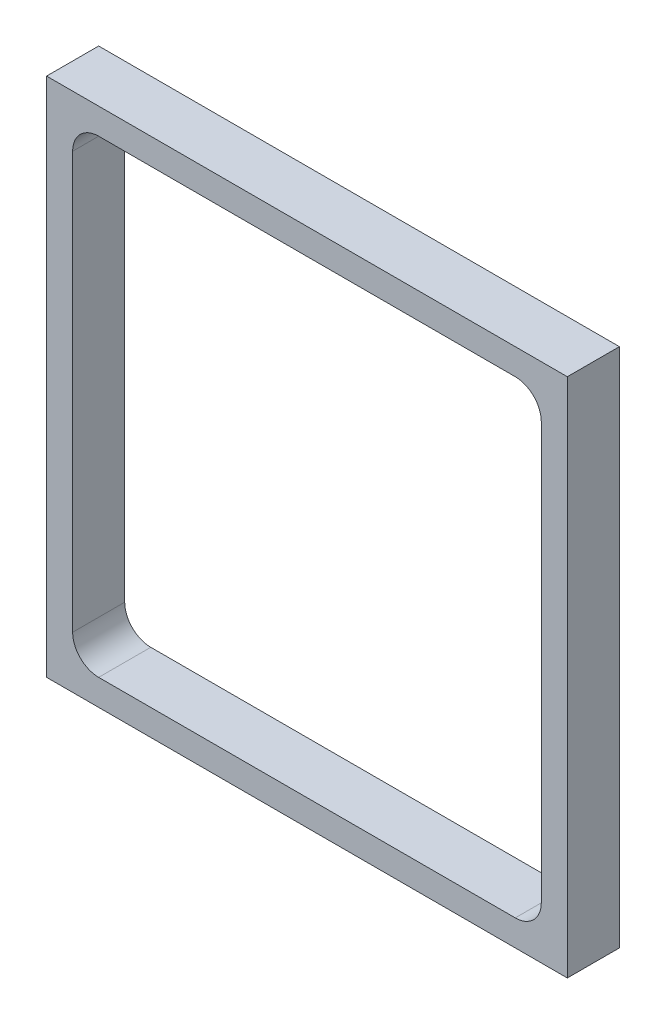
ISO-10303-21;
HEADER;
FILE_DESCRIPTION(('STEP AP214'),'2;1');
FILE_NAME('part.step','',(''),(''),'','','');
FILE_SCHEMA(('AUTOMOTIVE_DESIGN { 1 0 10303 214 1 1 1 1 }'));
ENDSEC;
DATA;
#1=APPLICATION_CONTEXT('core data for automotive mechanical design processes');
#2=APPLICATION_PROTOCOL_DEFINITION('international standard','automotive_design',2000,#1);
#3=PRODUCT_CONTEXT('',#1,'mechanical');
#4=PRODUCT('Part','Part','',(#3));
#5=PRODUCT_RELATED_PRODUCT_CATEGORY('part','',(#4));
#6=PRODUCT_DEFINITION_FORMATION('','',#4);
#7=PRODUCT_DEFINITION_CONTEXT('part definition',#1,'design');
#8=PRODUCT_DEFINITION('design','',#6,#7);
#9=PRODUCT_DEFINITION_SHAPE('','',#8);
#10=(LENGTH_UNIT() NAMED_UNIT(*) SI_UNIT(.MILLI.,.METRE.));
#11=(NAMED_UNIT(*) PLANE_ANGLE_UNIT() SI_UNIT($,.RADIAN.));
#12=(NAMED_UNIT(*) SI_UNIT($,.STERADIAN.) SOLID_ANGLE_UNIT());
#13=UNCERTAINTY_MEASURE_WITH_UNIT(LENGTH_MEASURE(1.E-05),#10,'distance_accuracy_value','');
#14=(GEOMETRIC_REPRESENTATION_CONTEXT(3) GLOBAL_UNCERTAINTY_ASSIGNED_CONTEXT((#13)) GLOBAL_UNIT_ASSIGNED_CONTEXT((#10,
#11,#12)) REPRESENTATION_CONTEXT('',''));
#15=CARTESIAN_POINT('',(0.,0.,0.));
#16=DIRECTION('',(0.,0.,1.));
#17=DIRECTION('',(1.,0.,0.));
#18=AXIS2_PLACEMENT_3D('',#15,#16,#17);
#19=CARTESIAN_POINT('',(63.5,-63.5,-12.7));
#20=DIRECTION('',(1.,0.,0.));
#21=DIRECTION('',(0.,0.,-1.));
#22=AXIS2_PLACEMENT_3D('',#19,#20,#21);
#23=PLANE('',#22);
#24=DIRECTION('',(0.,1.,0.));
#25=VECTOR('',#24,1.);
#26=CARTESIAN_POINT('',(63.5,-63.5,0.));
#27=LINE('',#26,#25);
#28=CARTESIAN_POINT('',(63.5,-63.5,0.));
#29=VERTEX_POINT('',#28);
#30=CARTESIAN_POINT('',(63.5,63.5,0.));
#31=VERTEX_POINT('',#30);
#32=EDGE_CURVE('E170',#29,#31,#27,.T.);
#33=ORIENTED_EDGE('',*,*,#32,.F.);
#34=DIRECTION('',(0.,0.,1.));
#35=VECTOR('',#34,1.);
#36=CARTESIAN_POINT('',(63.5,-63.5,-12.7));
#37=LINE('',#36,#35);
#38=CARTESIAN_POINT('',(63.5,-63.5,-12.7));
#39=VERTEX_POINT('',#38);
#40=EDGE_CURVE('E154',#39,#29,#37,.T.);
#41=ORIENTED_EDGE('',*,*,#40,.F.);
#42=DIRECTION('',(0.,1.,0.));
#43=VECTOR('',#42,1.);
#44=CARTESIAN_POINT('',(63.5,-63.5,-12.7));
#45=LINE('',#44,#43);
#46=CARTESIAN_POINT('',(63.5,63.5,-12.7));
#47=VERTEX_POINT('',#46);
#48=EDGE_CURVE('E148',#39,#47,#45,.T.);
#49=ORIENTED_EDGE('',*,*,#48,.T.);
#50=DIRECTION('',(0.,0.,1.));
#51=VECTOR('',#50,1.);
#52=CARTESIAN_POINT('',(63.5,63.5,-12.7));
#53=LINE('',#52,#51);
#54=EDGE_CURVE('E129',#47,#31,#53,.T.);
#55=ORIENTED_EDGE('',*,*,#54,.T.);
#56=EDGE_LOOP('',(#33,#41,#49,#55));
#57=FACE_BOUND('',#56,.T.);
#58=ADVANCED_FACE('F39',(#57),#23,.T.);
#59=CARTESIAN_POINT('',(-63.5,-63.5,-12.7));
#60=DIRECTION('',(0.,-1.,0.));
#61=DIRECTION('',(0.,0.,-1.));
#62=AXIS2_PLACEMENT_3D('',#59,#60,#61);
#63=PLANE('',#62);
#64=DIRECTION('',(1.,0.,0.));
#65=VECTOR('',#64,1.);
#66=CARTESIAN_POINT('',(-63.5,-63.5,0.));
#67=LINE('',#66,#65);
#68=CARTESIAN_POINT('',(-63.5,-63.5,0.));
#69=VERTEX_POINT('',#68);
#70=EDGE_CURVE('E156',#69,#29,#67,.T.);
#71=ORIENTED_EDGE('',*,*,#70,.F.);
#72=DIRECTION('',(0.,0.,1.));
#73=VECTOR('',#72,1.);
#74=CARTESIAN_POINT('',(-63.5,-63.5,-12.7));
#75=LINE('',#74,#73);
#76=CARTESIAN_POINT('',(-63.5,-63.5,-12.7));
#77=VERTEX_POINT('',#76);
#78=EDGE_CURVE('E182',#77,#69,#75,.T.);
#79=ORIENTED_EDGE('',*,*,#78,.F.);
#80=DIRECTION('',(1.,0.,0.));
#81=VECTOR('',#80,1.);
#82=CARTESIAN_POINT('',(-63.5,-63.5,-12.7));
#83=LINE('',#82,#81);
#84=EDGE_CURVE('E141',#77,#39,#83,.T.);
#85=ORIENTED_EDGE('',*,*,#84,.T.);
#86=ORIENTED_EDGE('',*,*,#40,.T.);
#87=EDGE_LOOP('',(#71,#79,#85,#86));
#88=FACE_BOUND('',#87,.T.);
#89=ADVANCED_FACE('F299',(#88),#63,.T.);
#90=CARTESIAN_POINT('',(-63.5,-63.5,-12.7));
#91=DIRECTION('',(-1.,0.,0.));
#92=DIRECTION('',(0.,0.,1.));
#93=AXIS2_PLACEMENT_3D('',#90,#91,#92);
#94=PLANE('',#93);
#95=DIRECTION('',(0.,-1.,0.));
#96=VECTOR('',#95,1.);
#97=CARTESIAN_POINT('',(-63.5,-63.5,0.));
#98=LINE('',#97,#96);
#99=CARTESIAN_POINT('',(-63.5,63.5,0.));
#100=VERTEX_POINT('',#99);
#101=EDGE_CURVE('E160',#100,#69,#98,.T.);
#102=ORIENTED_EDGE('',*,*,#101,.F.);
#103=DIRECTION('',(0.,0.,1.));
#104=VECTOR('',#103,1.);
#105=CARTESIAN_POINT('',(-63.5,63.5,-12.7));
#106=LINE('',#105,#104);
#107=CARTESIAN_POINT('',(-63.5,63.5,-12.7));
#108=VERTEX_POINT('',#107);
#109=EDGE_CURVE('E140',#108,#100,#106,.T.);
#110=ORIENTED_EDGE('',*,*,#109,.F.);
#111=DIRECTION('',(0.,-1.,0.));
#112=VECTOR('',#111,1.);
#113=CARTESIAN_POINT('',(-63.5,-63.5,-12.7));
#114=LINE('',#113,#112);
#115=EDGE_CURVE('E151',#108,#77,#114,.T.);
#116=ORIENTED_EDGE('',*,*,#115,.T.);
#117=ORIENTED_EDGE('',*,*,#78,.T.);
#118=EDGE_LOOP('',(#102,#110,#116,#117));
#119=FACE_BOUND('',#118,.T.);
#120=ADVANCED_FACE('F304',(#119),#94,.T.);
#121=CARTESIAN_POINT('',(-63.5,63.5,-12.7));
#122=DIRECTION('',(0.,1.,0.));
#123=DIRECTION('',(0.,0.,1.));
#124=AXIS2_PLACEMENT_3D('',#121,#122,#123);
#125=PLANE('',#124);
#126=DIRECTION('',(-1.,0.,0.));
#127=VECTOR('',#126,1.);
#128=CARTESIAN_POINT('',(-63.5,63.5,0.));
#129=LINE('',#128,#127);
#130=EDGE_CURVE('E134',#31,#100,#129,.T.);
#131=ORIENTED_EDGE('',*,*,#130,.F.);
#132=ORIENTED_EDGE('',*,*,#54,.F.);
#133=DIRECTION('',(-1.,0.,0.));
#134=VECTOR('',#133,1.);
#135=CARTESIAN_POINT('',(-63.5,63.5,-12.7));
#136=LINE('',#135,#134);
#137=EDGE_CURVE('E132',#47,#108,#136,.T.);
#138=ORIENTED_EDGE('',*,*,#137,.T.);
#139=ORIENTED_EDGE('',*,*,#109,.T.);
#140=EDGE_LOOP('',(#131,#132,#138,#139));
#141=FACE_BOUND('',#140,.T.);
#142=ADVANCED_FACE('F131',(#141),#125,.T.);
#143=CARTESIAN_POINT('',(0.,0.,-12.7));
#144=DIRECTION('',(0.,0.,-1.));
#145=DIRECTION('',(-1.,0.,0.));
#146=AXIS2_PLACEMENT_3D('',#143,#144,#145);
#147=PLANE('',#146);
#148=DIRECTION('',(1.,0.,0.));
#149=VECTOR('',#148,1.);
#150=CARTESIAN_POINT('',(-57.15,-57.15,-12.7));
#151=LINE('',#150,#149);
#152=CARTESIAN_POINT('',(-50.8,-57.15,-12.7));
#153=VERTEX_POINT('',#152);
#154=CARTESIAN_POINT('',(50.8,-57.15,-12.7));
#155=VERTEX_POINT('',#154);
#156=EDGE_CURVE('E173',#153,#155,#151,.T.);
#157=ORIENTED_EDGE('',*,*,#156,.T.);
#158=CARTESIAN_POINT('',(50.8,-50.8,-12.7));
#159=DIRECTION('',(0.,0.,-1.));
#160=DIRECTION('',(-1.,0.,0.));
#161=AXIS2_PLACEMENT_3D('',#158,#159,#160);
#162=CIRCLE('',#161,6.35);
#163=CARTESIAN_POINT('',(57.15,-50.8,-12.7));
#164=VERTEX_POINT('',#163);
#165=EDGE_CURVE('E216',#155,#164,#162,.F.);
#166=ORIENTED_EDGE('',*,*,#165,.T.);
#167=DIRECTION('',(0.,1.,0.));
#168=VECTOR('',#167,1.);
#169=CARTESIAN_POINT('',(57.15,-57.15,-12.7));
#170=LINE('',#169,#168);
#171=CARTESIAN_POINT('',(57.15,50.8,-12.7));
#172=VERTEX_POINT('',#171);
#173=EDGE_CURVE('E253',#164,#172,#170,.T.);
#174=ORIENTED_EDGE('',*,*,#173,.T.);
#175=CARTESIAN_POINT('',(50.8,50.8,-12.7));
#176=DIRECTION('',(0.,0.,-1.));
#177=DIRECTION('',(-1.,0.,0.));
#178=AXIS2_PLACEMENT_3D('',#175,#176,#177);
#179=CIRCLE('',#178,6.35);
#180=CARTESIAN_POINT('',(50.8,57.15,-12.7));
#181=VERTEX_POINT('',#180);
#182=EDGE_CURVE('E11',#172,#181,#179,.F.);
#183=ORIENTED_EDGE('',*,*,#182,.T.);
#184=DIRECTION('',(-1.,0.,0.));
#185=VECTOR('',#184,1.);
#186=CARTESIAN_POINT('',(-57.15,57.15,-12.7));
#187=LINE('',#186,#185);
#188=CARTESIAN_POINT('',(-50.8,57.15,-12.7));
#189=VERTEX_POINT('',#188);
#190=EDGE_CURVE('E249',#181,#189,#187,.T.);
#191=ORIENTED_EDGE('',*,*,#190,.T.);
#192=CARTESIAN_POINT('',(-50.8,50.8,-12.7));
#193=DIRECTION('',(0.,0.,-1.));
#194=DIRECTION('',(-1.,0.,0.));
#195=AXIS2_PLACEMENT_3D('',#192,#193,#194);
#196=CIRCLE('',#195,6.35);
#197=CARTESIAN_POINT('',(-57.15,50.8,-12.7));
#198=VERTEX_POINT('',#197);
#199=EDGE_CURVE('E228',#189,#198,#196,.F.);
#200=ORIENTED_EDGE('',*,*,#199,.T.);
#201=DIRECTION('',(0.,-1.,0.));
#202=VECTOR('',#201,1.);
#203=CARTESIAN_POINT('',(-57.15,-57.15,-12.7));
#204=LINE('',#203,#202);
#205=CARTESIAN_POINT('',(-57.15,-50.8,-12.7));
#206=VERTEX_POINT('',#205);
#207=EDGE_CURVE('E252',#198,#206,#204,.T.);
#208=ORIENTED_EDGE('',*,*,#207,.T.);
#209=CARTESIAN_POINT('',(-50.8,-50.8,-12.7));
#210=DIRECTION('',(0.,0.,-1.));
#211=DIRECTION('',(-1.,0.,0.));
#212=AXIS2_PLACEMENT_3D('',#209,#210,#211);
#213=CIRCLE('',#212,6.35);
#214=EDGE_CURVE('E222',#206,#153,#213,.F.);
#215=ORIENTED_EDGE('',*,*,#214,.T.);
#216=EDGE_LOOP('',(#157,#166,#174,#183,#191,#200,#208,#215));
#217=FACE_BOUND('',#216,.T.);
#218=ORIENTED_EDGE('',*,*,#48,.F.);
#219=ORIENTED_EDGE('',*,*,#84,.F.);
#220=ORIENTED_EDGE('',*,*,#115,.F.);
#221=ORIENTED_EDGE('',*,*,#137,.F.);
#222=EDGE_LOOP('',(#218,#219,#220,#221));
#223=FACE_BOUND('',#222,.T.);
#224=ADVANCED_FACE('F146',(#217,#223),#147,.T.);
#225=CARTESIAN_POINT('',(0.,0.,0.));
#226=DIRECTION('',(0.,0.,-1.));
#227=DIRECTION('',(-1.,0.,0.));
#228=AXIS2_PLACEMENT_3D('',#225,#226,#227);
#229=PLANE('',#228);
#230=DIRECTION('',(-1.,0.,0.));
#231=VECTOR('',#230,1.);
#232=CARTESIAN_POINT('',(-57.15,57.15,0.));
#233=LINE('',#232,#231);
#234=CARTESIAN_POINT('',(50.8,57.15,0.));
#235=VERTEX_POINT('',#234);
#236=CARTESIAN_POINT('',(-50.8,57.15,0.));
#237=VERTEX_POINT('',#236);
#238=EDGE_CURVE('E238',#235,#237,#233,.T.);
#239=ORIENTED_EDGE('',*,*,#238,.F.);
#240=CARTESIAN_POINT('',(50.8,50.8,0.));
#241=DIRECTION('',(0.,0.,-1.));
#242=DIRECTION('',(-1.,0.,0.));
#243=AXIS2_PLACEMENT_3D('',#240,#241,#242);
#244=CIRCLE('',#243,6.35);
#245=CARTESIAN_POINT('',(57.15,50.8,0.));
#246=VERTEX_POINT('',#245);
#247=EDGE_CURVE('E48',#235,#246,#244,.T.);
#248=ORIENTED_EDGE('',*,*,#247,.T.);
#249=DIRECTION('',(0.,1.,0.));
#250=VECTOR('',#249,1.);
#251=CARTESIAN_POINT('',(57.15,-57.15,0.));
#252=LINE('',#251,#250);
#253=CARTESIAN_POINT('',(57.15,-50.8,0.));
#254=VERTEX_POINT('',#253);
#255=EDGE_CURVE('E237',#254,#246,#252,.T.);
#256=ORIENTED_EDGE('',*,*,#255,.F.);
#257=CARTESIAN_POINT('',(50.8,-50.8,0.));
#258=DIRECTION('',(0.,0.,-1.));
#259=DIRECTION('',(-1.,0.,0.));
#260=AXIS2_PLACEMENT_3D('',#257,#258,#259);
#261=CIRCLE('',#260,6.35);
#262=CARTESIAN_POINT('',(50.8,-57.15,0.));
#263=VERTEX_POINT('',#262);
#264=EDGE_CURVE('E213',#254,#263,#261,.T.);
#265=ORIENTED_EDGE('',*,*,#264,.T.);
#266=DIRECTION('',(1.,0.,0.));
#267=VECTOR('',#266,1.);
#268=CARTESIAN_POINT('',(-57.15,-57.15,0.));
#269=LINE('',#268,#267);
#270=CARTESIAN_POINT('',(-50.8,-57.15,0.));
#271=VERTEX_POINT('',#270);
#272=EDGE_CURVE('E163',#271,#263,#269,.T.);
#273=ORIENTED_EDGE('',*,*,#272,.F.);
#274=CARTESIAN_POINT('',(-50.8,-50.8,0.));
#275=DIRECTION('',(0.,0.,-1.));
#276=DIRECTION('',(-1.,0.,0.));
#277=AXIS2_PLACEMENT_3D('',#274,#275,#276);
#278=CIRCLE('',#277,6.35);
#279=CARTESIAN_POINT('',(-57.15,-50.8,0.));
#280=VERTEX_POINT('',#279);
#281=EDGE_CURVE('E219',#271,#280,#278,.T.);
#282=ORIENTED_EDGE('',*,*,#281,.T.);
#283=DIRECTION('',(0.,-1.,0.));
#284=VECTOR('',#283,1.);
#285=CARTESIAN_POINT('',(-57.15,-57.15,0.));
#286=LINE('',#285,#284);
#287=CARTESIAN_POINT('',(-57.15,50.8,0.));
#288=VERTEX_POINT('',#287);
#289=EDGE_CURVE('E265',#288,#280,#286,.T.);
#290=ORIENTED_EDGE('',*,*,#289,.F.);
#291=CARTESIAN_POINT('',(-50.8,50.8,0.));
#292=DIRECTION('',(0.,0.,-1.));
#293=DIRECTION('',(-1.,0.,0.));
#294=AXIS2_PLACEMENT_3D('',#291,#292,#293);
#295=CIRCLE('',#294,6.35);
#296=EDGE_CURVE('E225',#288,#237,#295,.T.);
#297=ORIENTED_EDGE('',*,*,#296,.T.);
#298=EDGE_LOOP('',(#239,#248,#256,#265,#273,#282,#290,#297));
#299=FACE_BOUND('',#298,.T.);
#300=ORIENTED_EDGE('',*,*,#32,.T.);
#301=ORIENTED_EDGE('',*,*,#130,.T.);
#302=ORIENTED_EDGE('',*,*,#101,.T.);
#303=ORIENTED_EDGE('',*,*,#70,.T.);
#304=EDGE_LOOP('',(#300,#301,#302,#303));
#305=FACE_BOUND('',#304,.T.);
#306=ADVANCED_FACE('F235',(#299,#305),#229,.F.);
#307=CARTESIAN_POINT('',(57.15,-57.15,-12.7));
#308=DIRECTION('',(1.,0.,0.));
#309=DIRECTION('',(0.,0.,-1.));
#310=AXIS2_PLACEMENT_3D('',#307,#308,#309);
#311=PLANE('',#310);
#312=ORIENTED_EDGE('',*,*,#173,.F.);
#313=DIRECTION('',(0.,0.,1.));
#314=VECTOR('',#313,1.);
#315=CARTESIAN_POINT('',(57.15,-50.8,0.));
#316=LINE('',#315,#314);
#317=EDGE_CURVE('E189',#164,#254,#316,.T.);
#318=ORIENTED_EDGE('',*,*,#317,.T.);
#319=ORIENTED_EDGE('',*,*,#255,.T.);
#320=DIRECTION('',(0.,0.,1.));
#321=VECTOR('',#320,1.);
#322=CARTESIAN_POINT('',(57.15,50.8,-12.7));
#323=LINE('',#322,#321);
#324=EDGE_CURVE('E181',#246,#172,#323,.F.);
#325=ORIENTED_EDGE('',*,*,#324,.T.);
#326=EDGE_LOOP('',(#312,#318,#319,#325));
#327=FACE_BOUND('',#326,.T.);
#328=ADVANCED_FACE('F244',(#327),#311,.F.);
#329=CARTESIAN_POINT('',(-57.15,-57.15,-12.7));
#330=DIRECTION('',(0.,-1.,0.));
#331=DIRECTION('',(0.,0.,-1.));
#332=AXIS2_PLACEMENT_3D('',#329,#330,#331);
#333=PLANE('',#332);
#334=ORIENTED_EDGE('',*,*,#272,.T.);
#335=DIRECTION('',(0.,0.,1.));
#336=VECTOR('',#335,1.);
#337=CARTESIAN_POINT('',(50.8,-57.15,-12.7));
#338=LINE('',#337,#336);
#339=EDGE_CURVE('E197',#263,#155,#338,.F.);
#340=ORIENTED_EDGE('',*,*,#339,.T.);
#341=ORIENTED_EDGE('',*,*,#156,.F.);
#342=DIRECTION('',(0.,0.,1.));
#343=VECTOR('',#342,1.);
#344=CARTESIAN_POINT('',(-50.8,-57.15,0.));
#345=LINE('',#344,#343);
#346=EDGE_CURVE('E193',#153,#271,#345,.T.);
#347=ORIENTED_EDGE('',*,*,#346,.T.);
#348=EDGE_LOOP('',(#334,#340,#341,#347));
#349=FACE_BOUND('',#348,.T.);
#350=ADVANCED_FACE('F276',(#349),#333,.F.);
#351=CARTESIAN_POINT('',(-57.15,-57.15,-12.7));
#352=DIRECTION('',(-1.,0.,0.));
#353=DIRECTION('',(0.,0.,1.));
#354=AXIS2_PLACEMENT_3D('',#351,#352,#353);
#355=PLANE('',#354);
#356=ORIENTED_EDGE('',*,*,#289,.T.);
#357=DIRECTION('',(0.,0.,1.));
#358=VECTOR('',#357,1.);
#359=CARTESIAN_POINT('',(-57.15,-50.8,-12.7));
#360=LINE('',#359,#358);
#361=EDGE_CURVE('E204',#280,#206,#360,.F.);
#362=ORIENTED_EDGE('',*,*,#361,.T.);
#363=ORIENTED_EDGE('',*,*,#207,.F.);
#364=DIRECTION('',(0.,0.,1.));
#365=VECTOR('',#364,1.);
#366=CARTESIAN_POINT('',(-57.15,50.8,0.));
#367=LINE('',#366,#365);
#368=EDGE_CURVE('E200',#198,#288,#367,.T.);
#369=ORIENTED_EDGE('',*,*,#368,.T.);
#370=EDGE_LOOP('',(#356,#362,#363,#369));
#371=FACE_BOUND('',#370,.T.);
#372=ADVANCED_FACE('F289',(#371),#355,.F.);
#373=CARTESIAN_POINT('',(-57.15,57.15,-12.7));
#374=DIRECTION('',(0.,1.,0.));
#375=DIRECTION('',(0.,0.,1.));
#376=AXIS2_PLACEMENT_3D('',#373,#374,#375);
#377=PLANE('',#376);
#378=ORIENTED_EDGE('',*,*,#238,.T.);
#379=DIRECTION('',(0.,0.,1.));
#380=VECTOR('',#379,1.);
#381=CARTESIAN_POINT('',(-50.8,57.15,-12.7));
#382=LINE('',#381,#380);
#383=EDGE_CURVE('E55',#237,#189,#382,.F.);
#384=ORIENTED_EDGE('',*,*,#383,.T.);
#385=ORIENTED_EDGE('',*,*,#190,.F.);
#386=DIRECTION('',(0.,0.,1.));
#387=VECTOR('',#386,1.);
#388=CARTESIAN_POINT('',(50.8,57.15,0.));
#389=LINE('',#388,#387);
#390=EDGE_CURVE('E207',#181,#235,#389,.T.);
#391=ORIENTED_EDGE('',*,*,#390,.T.);
#392=EDGE_LOOP('',(#378,#384,#385,#391));
#393=FACE_BOUND('',#392,.T.);
#394=ADVANCED_FACE('F248',(#393),#377,.F.);
#395=CARTESIAN_POINT('',(50.8,-50.8,-12.7));
#396=DIRECTION('',(0.,0.,-1.));
#397=DIRECTION('',(-1.,0.,0.));
#398=AXIS2_PLACEMENT_3D('',#395,#396,#397);
#399=CYLINDRICAL_SURFACE('',#398,6.35);
#400=ORIENTED_EDGE('',*,*,#165,.F.);
#401=ORIENTED_EDGE('',*,*,#339,.F.);
#402=ORIENTED_EDGE('',*,*,#264,.F.);
#403=ORIENTED_EDGE('',*,*,#317,.F.);
#404=EDGE_LOOP('',(#400,#401,#402,#403));
#405=FACE_BOUND('',#404,.T.);
#406=ADVANCED_FACE('F281',(#405),#399,.F.);
#407=CARTESIAN_POINT('',(-50.8,-50.8,-12.7));
#408=DIRECTION('',(0.,0.,-1.));
#409=DIRECTION('',(-1.,0.,0.));
#410=AXIS2_PLACEMENT_3D('',#407,#408,#409);
#411=CYLINDRICAL_SURFACE('',#410,6.35);
#412=ORIENTED_EDGE('',*,*,#214,.F.);
#413=ORIENTED_EDGE('',*,*,#361,.F.);
#414=ORIENTED_EDGE('',*,*,#281,.F.);
#415=ORIENTED_EDGE('',*,*,#346,.F.);
#416=EDGE_LOOP('',(#412,#413,#414,#415));
#417=FACE_BOUND('',#416,.T.);
#418=ADVANCED_FACE('F284',(#417),#411,.F.);
#419=CARTESIAN_POINT('',(-50.8,50.8,-12.7));
#420=DIRECTION('',(0.,0.,-1.));
#421=DIRECTION('',(-1.,0.,0.));
#422=AXIS2_PLACEMENT_3D('',#419,#420,#421);
#423=CYLINDRICAL_SURFACE('',#422,6.35);
#424=ORIENTED_EDGE('',*,*,#199,.F.);
#425=ORIENTED_EDGE('',*,*,#383,.F.);
#426=ORIENTED_EDGE('',*,*,#296,.F.);
#427=ORIENTED_EDGE('',*,*,#368,.F.);
#428=EDGE_LOOP('',(#424,#425,#426,#427));
#429=FACE_BOUND('',#428,.T.);
#430=ADVANCED_FACE('F287',(#429),#423,.F.);
#431=CARTESIAN_POINT('',(50.8,50.8,-12.7));
#432=DIRECTION('',(0.,0.,-1.));
#433=DIRECTION('',(-1.,0.,0.));
#434=AXIS2_PLACEMENT_3D('',#431,#432,#433);
#435=CYLINDRICAL_SURFACE('',#434,6.35);
#436=ORIENTED_EDGE('',*,*,#182,.F.);
#437=ORIENTED_EDGE('',*,*,#324,.F.);
#438=ORIENTED_EDGE('',*,*,#247,.F.);
#439=ORIENTED_EDGE('',*,*,#390,.F.);
#440=EDGE_LOOP('',(#436,#437,#438,#439));
#441=FACE_BOUND('',#440,.T.);
#442=ADVANCED_FACE('F41',(#441),#435,.F.);
#443=CLOSED_SHELL('',(#58,#89,#120,#142,#224,#306,#328,#350,#372,#394,#406,#418,#430,#442));
#444=MANIFOLD_SOLID_BREP('B2',#443);
#445=ADVANCED_BREP_SHAPE_REPRESENTATION('',(#18,#444),#14);
#446=SHAPE_DEFINITION_REPRESENTATION(#9,#445);
ENDSEC;
END-ISO-10303-21;
